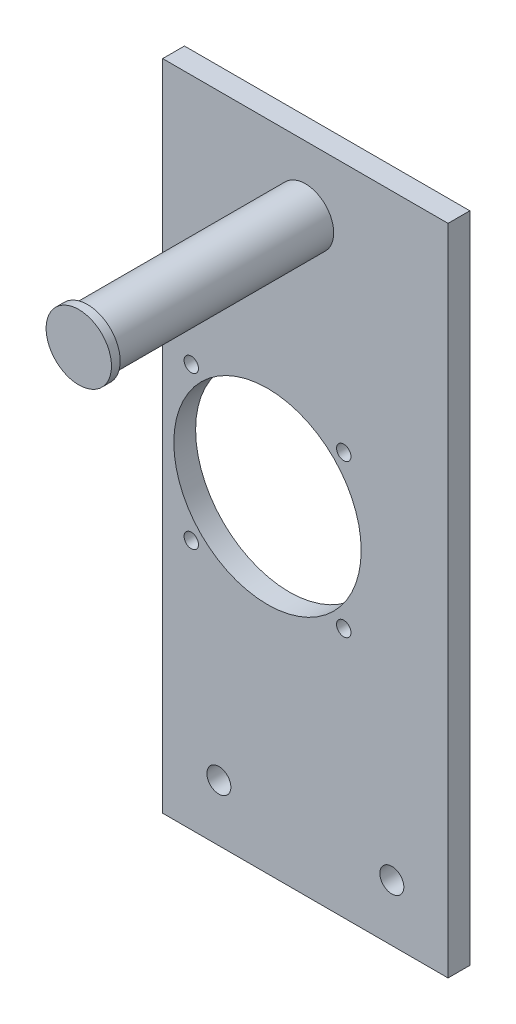
ISO-10303-21;
HEADER;
FILE_DESCRIPTION(('STEP AP214'),'2;1');
FILE_NAME('part.step','',(''),(''),'','','');
FILE_SCHEMA(('AUTOMOTIVE_DESIGN { 1 0 10303 214 1 1 1 1 }'));
ENDSEC;
DATA;
#1=APPLICATION_CONTEXT('core data for automotive mechanical design processes');
#2=APPLICATION_PROTOCOL_DEFINITION('international standard','automotive_design',2000,#1);
#3=PRODUCT_CONTEXT('',#1,'mechanical');
#4=PRODUCT('Part','Part','',(#3));
#5=PRODUCT_RELATED_PRODUCT_CATEGORY('part','',(#4));
#6=PRODUCT_DEFINITION_FORMATION('','',#4);
#7=PRODUCT_DEFINITION_CONTEXT('part definition',#1,'design');
#8=PRODUCT_DEFINITION('design','',#6,#7);
#9=PRODUCT_DEFINITION_SHAPE('','',#8);
#10=(LENGTH_UNIT() NAMED_UNIT(*) SI_UNIT(.MILLI.,.METRE.));
#11=(NAMED_UNIT(*) PLANE_ANGLE_UNIT() SI_UNIT($,.RADIAN.));
#12=(NAMED_UNIT(*) SI_UNIT($,.STERADIAN.) SOLID_ANGLE_UNIT());
#13=UNCERTAINTY_MEASURE_WITH_UNIT(LENGTH_MEASURE(1.E-05),#10,'distance_accuracy_value','');
#14=(GEOMETRIC_REPRESENTATION_CONTEXT(3) GLOBAL_UNCERTAINTY_ASSIGNED_CONTEXT((#13)) GLOBAL_UNIT_ASSIGNED_CONTEXT((#10,
#11,#12)) REPRESENTATION_CONTEXT('',''));
#15=CARTESIAN_POINT('',(0.,0.,0.));
#16=DIRECTION('',(0.,0.,1.));
#17=DIRECTION('',(1.,0.,0.));
#18=AXIS2_PLACEMENT_3D('',#15,#16,#17);
#19=CARTESIAN_POINT('',(0.,0.,5.));
#20=DIRECTION('',(0.,0.,1.));
#21=DIRECTION('',(1.,0.,0.));
#22=AXIS2_PLACEMENT_3D('',#19,#20,#21);
#23=PLANE('',#22);
#24=CARTESIAN_POINT('',(8.81290508670128,-17.5,5.));
#25=DIRECTION('',(0.,0.,1.));
#26=DIRECTION('',(1.,0.,0.));
#27=AXIS2_PLACEMENT_3D('',#24,#25,#26);
#28=CIRCLE('',#27,1.65);
#29=CARTESIAN_POINT('',(7.16290508670128,-17.5,4.99999999999999));
#30=VERTEX_POINT('',#29);
#31=EDGE_CURVE('E143',#30,#30,#28,.T.);
#32=ORIENTED_EDGE('',*,*,#31,.F.);
#33=EDGE_LOOP('',(#32));
#34=FACE_BOUND('',#33,.T.);
#35=CARTESIAN_POINT('',(-26.1870949132987,17.5,5.));
#36=DIRECTION('',(0.,0.,1.));
#37=DIRECTION('',(1.,0.,0.));
#38=AXIS2_PLACEMENT_3D('',#35,#36,#37);
#39=CIRCLE('',#38,1.65);
#40=CARTESIAN_POINT('',(-27.8370949132987,17.5,4.99999999999999));
#41=VERTEX_POINT('',#40);
#42=EDGE_CURVE('E148',#41,#41,#39,.T.);
#43=ORIENTED_EDGE('',*,*,#42,.F.);
#44=EDGE_LOOP('',(#43));
#45=FACE_BOUND('',#44,.T.);
#46=CARTESIAN_POINT('',(-8.68709491329872,0.,5.));
#47=DIRECTION('',(0.,0.,1.));
#48=DIRECTION('',(1.,0.,0.));
#49=AXIS2_PLACEMENT_3D('',#46,#47,#48);
#50=CIRCLE('',#49,21.5);
#51=CARTESIAN_POINT('',(-30.1870949132987,0.,4.99999999999999));
#52=VERTEX_POINT('',#51);
#53=EDGE_CURVE('E151',#52,#52,#50,.T.);
#54=ORIENTED_EDGE('',*,*,#53,.F.);
#55=EDGE_LOOP('',(#54));
#56=FACE_BOUND('',#55,.T.);
#57=CARTESIAN_POINT('',(-26.1870949132987,-17.5,5.));
#58=DIRECTION('',(0.,0.,1.));
#59=DIRECTION('',(1.,0.,0.));
#60=AXIS2_PLACEMENT_3D('',#57,#58,#59);
#61=CIRCLE('',#60,1.65);
#62=CARTESIAN_POINT('',(-27.8370949132987,-17.5,4.99999999999999));
#63=VERTEX_POINT('',#62);
#64=EDGE_CURVE('E154',#63,#63,#61,.T.);
#65=ORIENTED_EDGE('',*,*,#64,.F.);
#66=EDGE_LOOP('',(#65));
#67=FACE_BOUND('',#66,.T.);
#68=CARTESIAN_POINT('',(8.81290508670128,17.5,5.));
#69=DIRECTION('',(0.,0.,1.));
#70=DIRECTION('',(1.,0.,0.));
#71=AXIS2_PLACEMENT_3D('',#68,#69,#70);
#72=CIRCLE('',#71,1.65);
#73=CARTESIAN_POINT('',(7.16290508670128,17.5,4.99999999999999));
#74=VERTEX_POINT('',#73);
#75=EDGE_CURVE('E157',#74,#74,#72,.T.);
#76=ORIENTED_EDGE('',*,*,#75,.F.);
#77=EDGE_LOOP('',(#76));
#78=FACE_BOUND('',#77,.T.);
#79=CARTESIAN_POINT('',(0.,60.,5.));
#80=DIRECTION('',(0.,0.,1.));
#81=DIRECTION('',(1.,0.,0.));
#82=AXIS2_PLACEMENT_3D('',#79,#80,#81);
#83=CIRCLE('',#82,6.5);
#84=CARTESIAN_POINT('',(6.5,60.,5.));
#85=VERTEX_POINT('',#84);
#86=EDGE_CURVE('E134',#85,#85,#83,.T.);
#87=ORIENTED_EDGE('',*,*,#86,.F.);
#88=EDGE_LOOP('',(#87));
#89=FACE_BOUND('',#88,.T.);
#90=CARTESIAN_POINT('',(-19.85,-62.,5.));
#91=DIRECTION('',(0.,0.,1.));
#92=DIRECTION('',(1.,0.,0.));
#93=AXIS2_PLACEMENT_3D('',#90,#91,#92);
#94=CIRCLE('',#93,2.75);
#95=CARTESIAN_POINT('',(-17.1,-62.,5.));
#96=VERTEX_POINT('',#95);
#97=EDGE_CURVE('E110',#96,#96,#94,.T.);
#98=ORIENTED_EDGE('',*,*,#97,.F.);
#99=EDGE_LOOP('',(#98));
#100=FACE_BOUND('',#99,.T.);
#101=DIRECTION('',(0.,-1.,0.));
#102=VECTOR('',#101,1.);
#103=CARTESIAN_POINT('',(-32.75,-75.,5.));
#104=LINE('',#103,#102);
#105=CARTESIAN_POINT('',(-32.75,75.,5.));
#106=VERTEX_POINT('',#105);
#107=CARTESIAN_POINT('',(-32.75,-75.,5.));
#108=VERTEX_POINT('',#107);
#109=EDGE_CURVE('E95',#106,#108,#104,.T.);
#110=ORIENTED_EDGE('',*,*,#109,.T.);
#111=DIRECTION('',(1.,0.,0.));
#112=VECTOR('',#111,1.);
#113=CARTESIAN_POINT('',(32.75,-75.,5.));
#114=LINE('',#113,#112);
#115=CARTESIAN_POINT('',(32.75,-75.,5.));
#116=VERTEX_POINT('',#115);
#117=EDGE_CURVE('E90',#108,#116,#114,.T.);
#118=ORIENTED_EDGE('',*,*,#117,.T.);
#119=DIRECTION('',(0.,1.,0.));
#120=VECTOR('',#119,1.);
#121=CARTESIAN_POINT('',(32.75,-75.,5.));
#122=LINE('',#121,#120);
#123=CARTESIAN_POINT('',(32.75,75.,5.));
#124=VERTEX_POINT('',#123);
#125=EDGE_CURVE('E93',#116,#124,#122,.T.);
#126=ORIENTED_EDGE('',*,*,#125,.T.);
#127=DIRECTION('',(-1.,0.,0.));
#128=VECTOR('',#127,1.);
#129=CARTESIAN_POINT('',(32.75,75.,5.));
#130=LINE('',#129,#128);
#131=EDGE_CURVE('E60',#124,#106,#130,.T.);
#132=ORIENTED_EDGE('',*,*,#131,.T.);
#133=EDGE_LOOP('',(#110,#118,#126,#132));
#134=FACE_BOUND('',#133,.T.);
#135=CARTESIAN_POINT('',(19.85,-62.,5.));
#136=DIRECTION('',(0.,0.,1.));
#137=DIRECTION('',(1.,0.,0.));
#138=AXIS2_PLACEMENT_3D('',#135,#136,#137);
#139=CIRCLE('',#138,2.75);
#140=CARTESIAN_POINT('',(22.6,-62.,5.));
#141=VERTEX_POINT('',#140);
#142=EDGE_CURVE('E125',#141,#141,#139,.T.);
#143=ORIENTED_EDGE('',*,*,#142,.F.);
#144=EDGE_LOOP('',(#143));
#145=FACE_BOUND('',#144,.T.);
#146=ADVANCED_FACE('F43',(#34,#45,#56,#67,#78,#89,#100,#134,#145),#23,.T.);
#147=CARTESIAN_POINT('',(0.,0.,0.));
#148=DIRECTION('',(0.,0.,1.));
#149=DIRECTION('',(1.,0.,0.));
#150=AXIS2_PLACEMENT_3D('',#147,#148,#149);
#151=PLANE('',#150);
#152=CARTESIAN_POINT('',(8.81290508670128,-17.5,0.));
#153=DIRECTION('',(0.,0.,-1.));
#154=DIRECTION('',(-1.,0.,0.));
#155=AXIS2_PLACEMENT_3D('',#152,#153,#154);
#156=CIRCLE('',#155,1.65);
#157=CARTESIAN_POINT('',(7.16290508670128,-17.5,0.));
#158=VERTEX_POINT('',#157);
#159=EDGE_CURVE('E163',#158,#158,#156,.T.);
#160=ORIENTED_EDGE('',*,*,#159,.F.);
#161=EDGE_LOOP('',(#160));
#162=FACE_BOUND('',#161,.T.);
#163=CARTESIAN_POINT('',(-26.1870949132987,17.5,0.));
#164=DIRECTION('',(0.,0.,-1.));
#165=DIRECTION('',(-1.,0.,0.));
#166=AXIS2_PLACEMENT_3D('',#163,#164,#165);
#167=CIRCLE('',#166,1.65);
#168=CARTESIAN_POINT('',(-27.8370949132987,17.5,0.));
#169=VERTEX_POINT('',#168);
#170=EDGE_CURVE('E164',#169,#169,#167,.T.);
#171=ORIENTED_EDGE('',*,*,#170,.F.);
#172=EDGE_LOOP('',(#171));
#173=FACE_BOUND('',#172,.T.);
#174=CARTESIAN_POINT('',(-8.68709491329872,0.,0.));
#175=DIRECTION('',(0.,0.,-1.));
#176=DIRECTION('',(-1.,0.,0.));
#177=AXIS2_PLACEMENT_3D('',#174,#175,#176);
#178=CIRCLE('',#177,21.5);
#179=CARTESIAN_POINT('',(-30.1870949132987,0.,0.));
#180=VERTEX_POINT('',#179);
#181=EDGE_CURVE('E172',#180,#180,#178,.T.);
#182=ORIENTED_EDGE('',*,*,#181,.F.);
#183=EDGE_LOOP('',(#182));
#184=FACE_BOUND('',#183,.T.);
#185=CARTESIAN_POINT('',(-26.1870949132987,-17.5,0.));
#186=DIRECTION('',(0.,0.,-1.));
#187=DIRECTION('',(-1.,0.,0.));
#188=AXIS2_PLACEMENT_3D('',#185,#186,#187);
#189=CIRCLE('',#188,1.65);
#190=CARTESIAN_POINT('',(-27.8370949132987,-17.5,0.));
#191=VERTEX_POINT('',#190);
#192=EDGE_CURVE('E167',#191,#191,#189,.T.);
#193=ORIENTED_EDGE('',*,*,#192,.F.);
#194=EDGE_LOOP('',(#193));
#195=FACE_BOUND('',#194,.T.);
#196=CARTESIAN_POINT('',(8.81290508670128,17.5,0.));
#197=DIRECTION('',(0.,0.,-1.));
#198=DIRECTION('',(-1.,0.,0.));
#199=AXIS2_PLACEMENT_3D('',#196,#197,#198);
#200=CIRCLE('',#199,1.65);
#201=CARTESIAN_POINT('',(7.16290508670128,17.5,0.));
#202=VERTEX_POINT('',#201);
#203=EDGE_CURVE('E160',#202,#202,#200,.T.);
#204=ORIENTED_EDGE('',*,*,#203,.F.);
#205=EDGE_LOOP('',(#204));
#206=FACE_BOUND('',#205,.T.);
#207=DIRECTION('',(0.,-1.,0.));
#208=VECTOR('',#207,1.);
#209=CARTESIAN_POINT('',(-32.75,-75.,0.));
#210=LINE('',#209,#208);
#211=CARTESIAN_POINT('',(-32.75,75.,0.));
#212=VERTEX_POINT('',#211);
#213=CARTESIAN_POINT('',(-32.75,-75.,0.));
#214=VERTEX_POINT('',#213);
#215=EDGE_CURVE('E107',#212,#214,#210,.T.);
#216=ORIENTED_EDGE('',*,*,#215,.F.);
#217=DIRECTION('',(-1.,0.,0.));
#218=VECTOR('',#217,1.);
#219=CARTESIAN_POINT('',(32.75,75.,0.));
#220=LINE('',#219,#218);
#221=CARTESIAN_POINT('',(32.75,75.,0.));
#222=VERTEX_POINT('',#221);
#223=EDGE_CURVE('E83',#222,#212,#220,.T.);
#224=ORIENTED_EDGE('',*,*,#223,.F.);
#225=DIRECTION('',(0.,1.,0.));
#226=VECTOR('',#225,1.);
#227=CARTESIAN_POINT('',(32.75,-75.,0.));
#228=LINE('',#227,#226);
#229=CARTESIAN_POINT('',(32.75,-75.,0.));
#230=VERTEX_POINT('',#229);
#231=EDGE_CURVE('E77',#230,#222,#228,.T.);
#232=ORIENTED_EDGE('',*,*,#231,.F.);
#233=DIRECTION('',(1.,0.,0.));
#234=VECTOR('',#233,1.);
#235=CARTESIAN_POINT('',(32.75,-75.,0.));
#236=LINE('',#235,#234);
#237=EDGE_CURVE('E99',#214,#230,#236,.T.);
#238=ORIENTED_EDGE('',*,*,#237,.F.);
#239=EDGE_LOOP('',(#216,#224,#232,#238));
#240=FACE_BOUND('',#239,.T.);
#241=CARTESIAN_POINT('',(-19.85,-62.,0.));
#242=DIRECTION('',(0.,0.,1.));
#243=DIRECTION('',(1.,0.,0.));
#244=AXIS2_PLACEMENT_3D('',#241,#242,#243);
#245=CIRCLE('',#244,2.75);
#246=CARTESIAN_POINT('',(-17.1,-62.,0.));
#247=VERTEX_POINT('',#246);
#248=EDGE_CURVE('E122',#247,#247,#245,.T.);
#249=ORIENTED_EDGE('',*,*,#248,.T.);
#250=EDGE_LOOP('',(#249));
#251=FACE_BOUND('',#250,.T.);
#252=CARTESIAN_POINT('',(19.85,-62.,0.));
#253=DIRECTION('',(0.,0.,1.));
#254=DIRECTION('',(1.,0.,0.));
#255=AXIS2_PLACEMENT_3D('',#252,#253,#254);
#256=CIRCLE('',#255,2.75);
#257=CARTESIAN_POINT('',(22.6,-62.,0.));
#258=VERTEX_POINT('',#257);
#259=EDGE_CURVE('E128',#258,#258,#256,.T.);
#260=ORIENTED_EDGE('',*,*,#259,.T.);
#261=EDGE_LOOP('',(#260));
#262=FACE_BOUND('',#261,.T.);
#263=ADVANCED_FACE('F118',(#162,#173,#184,#195,#206,#240,#251,#262),#151,.F.);
#264=CARTESIAN_POINT('',(-32.75,-75.,5.));
#265=DIRECTION('',(1.,0.,0.));
#266=DIRECTION('',(0.,0.,-1.));
#267=AXIS2_PLACEMENT_3D('',#264,#265,#266);
#268=PLANE('',#267);
#269=ORIENTED_EDGE('',*,*,#215,.T.);
#270=DIRECTION('',(0.,0.,-1.));
#271=VECTOR('',#270,1.);
#272=CARTESIAN_POINT('',(-32.75,-75.,5.));
#273=LINE('',#272,#271);
#274=EDGE_CURVE('E11',#108,#214,#273,.T.);
#275=ORIENTED_EDGE('',*,*,#274,.F.);
#276=ORIENTED_EDGE('',*,*,#109,.F.);
#277=DIRECTION('',(0.,0.,-1.));
#278=VECTOR('',#277,1.);
#279=CARTESIAN_POINT('',(-32.75,75.,5.));
#280=LINE('',#279,#278);
#281=EDGE_CURVE('E103',#106,#212,#280,.T.);
#282=ORIENTED_EDGE('',*,*,#281,.T.);
#283=EDGE_LOOP('',(#269,#275,#276,#282));
#284=FACE_BOUND('',#283,.T.);
#285=ADVANCED_FACE('F45',(#284),#268,.F.);
#286=CARTESIAN_POINT('',(32.75,-75.,5.));
#287=DIRECTION('',(0.,1.,0.));
#288=DIRECTION('',(0.,0.,1.));
#289=AXIS2_PLACEMENT_3D('',#286,#287,#288);
#290=PLANE('',#289);
#291=ORIENTED_EDGE('',*,*,#237,.T.);
#292=DIRECTION('',(0.,0.,-1.));
#293=VECTOR('',#292,1.);
#294=CARTESIAN_POINT('',(32.75,-75.,5.));
#295=LINE('',#294,#293);
#296=EDGE_CURVE('E52',#116,#230,#295,.T.);
#297=ORIENTED_EDGE('',*,*,#296,.F.);
#298=ORIENTED_EDGE('',*,*,#117,.F.);
#299=ORIENTED_EDGE('',*,*,#274,.T.);
#300=EDGE_LOOP('',(#291,#297,#298,#299));
#301=FACE_BOUND('',#300,.T.);
#302=ADVANCED_FACE('F98',(#301),#290,.F.);
#303=CARTESIAN_POINT('',(32.75,-75.,5.));
#304=DIRECTION('',(-1.,0.,0.));
#305=DIRECTION('',(0.,0.,1.));
#306=AXIS2_PLACEMENT_3D('',#303,#304,#305);
#307=PLANE('',#306);
#308=ORIENTED_EDGE('',*,*,#231,.T.);
#309=DIRECTION('',(0.,0.,-1.));
#310=VECTOR('',#309,1.);
#311=CARTESIAN_POINT('',(32.75,75.,5.));
#312=LINE('',#311,#310);
#313=EDGE_CURVE('E100',#124,#222,#312,.T.);
#314=ORIENTED_EDGE('',*,*,#313,.F.);
#315=ORIENTED_EDGE('',*,*,#125,.F.);
#316=ORIENTED_EDGE('',*,*,#296,.T.);
#317=EDGE_LOOP('',(#308,#314,#315,#316));
#318=FACE_BOUND('',#317,.T.);
#319=ADVANCED_FACE('F101',(#318),#307,.F.);
#320=CARTESIAN_POINT('',(32.75,75.,5.));
#321=DIRECTION('',(0.,-1.,0.));
#322=DIRECTION('',(1.,0.,0.));
#323=AXIS2_PLACEMENT_3D('',#320,#321,#322);
#324=PLANE('',#323);
#325=ORIENTED_EDGE('',*,*,#223,.T.);
#326=ORIENTED_EDGE('',*,*,#281,.F.);
#327=ORIENTED_EDGE('',*,*,#131,.F.);
#328=ORIENTED_EDGE('',*,*,#313,.T.);
#329=EDGE_LOOP('',(#325,#326,#327,#328));
#330=FACE_BOUND('',#329,.T.);
#331=ADVANCED_FACE('F115',(#330),#324,.F.);
#332=CARTESIAN_POINT('',(-19.85,-62.,5.));
#333=DIRECTION('',(0.,0.,-1.));
#334=DIRECTION('',(-1.,0.,0.));
#335=AXIS2_PLACEMENT_3D('',#332,#333,#334);
#336=CYLINDRICAL_SURFACE('',#335,2.75);
#337=ORIENTED_EDGE('',*,*,#97,.T.);
#338=EDGE_LOOP('',(#337));
#339=FACE_BOUND('',#338,.T.);
#340=ORIENTED_EDGE('',*,*,#248,.F.);
#341=EDGE_LOOP('',(#340));
#342=FACE_BOUND('',#341,.T.);
#343=ADVANCED_FACE('F211',(#339,#342),#336,.F.);
#344=CARTESIAN_POINT('',(19.85,-62.,5.));
#345=DIRECTION('',(0.,0.,-1.));
#346=DIRECTION('',(-1.,0.,0.));
#347=AXIS2_PLACEMENT_3D('',#344,#345,#346);
#348=CYLINDRICAL_SURFACE('',#347,2.75);
#349=ORIENTED_EDGE('',*,*,#142,.T.);
#350=EDGE_LOOP('',(#349));
#351=FACE_BOUND('',#350,.T.);
#352=ORIENTED_EDGE('',*,*,#259,.F.);
#353=EDGE_LOOP('',(#352));
#354=FACE_BOUND('',#353,.T.);
#355=ADVANCED_FACE('F253',(#351,#354),#348,.F.);
#356=CARTESIAN_POINT('',(0.,60.,55.));
#357=DIRECTION('',(0.,0.,-1.));
#358=DIRECTION('',(-1.,0.,0.));
#359=AXIS2_PLACEMENT_3D('',#356,#357,#358);
#360=CYLINDRICAL_SURFACE('',#359,6.5);
#361=CARTESIAN_POINT('',(0.,60.,55.));
#362=DIRECTION('',(0.,0.,1.));
#363=DIRECTION('',(1.,0.,0.));
#364=AXIS2_PLACEMENT_3D('',#361,#362,#363);
#365=CIRCLE('',#364,6.5);
#366=CARTESIAN_POINT('',(6.5,60.,55.));
#367=VERTEX_POINT('',#366);
#368=EDGE_CURVE('E131',#367,#367,#365,.T.);
#369=ORIENTED_EDGE('',*,*,#368,.F.);
#370=EDGE_LOOP('',(#369));
#371=FACE_BOUND('',#370,.T.);
#372=ORIENTED_EDGE('',*,*,#86,.T.);
#373=EDGE_LOOP('',(#372));
#374=FACE_BOUND('',#373,.T.);
#375=ADVANCED_FACE('F262',(#371,#374),#360,.T.);
#376=CARTESIAN_POINT('',(0.,60.,57.));
#377=DIRECTION('',(0.,0.,-1.));
#378=DIRECTION('',(-1.,0.,0.));
#379=AXIS2_PLACEMENT_3D('',#376,#377,#378);
#380=CYLINDRICAL_SURFACE('',#379,7.5);
#381=CARTESIAN_POINT('',(0.,60.,57.));
#382=DIRECTION('',(0.,0.,1.));
#383=DIRECTION('',(1.,0.,0.));
#384=AXIS2_PLACEMENT_3D('',#381,#382,#383);
#385=CIRCLE('',#384,7.5);
#386=CARTESIAN_POINT('',(7.5,60.,57.));
#387=VERTEX_POINT('',#386);
#388=EDGE_CURVE('E137',#387,#387,#385,.T.);
#389=ORIENTED_EDGE('',*,*,#388,.F.);
#390=EDGE_LOOP('',(#389));
#391=FACE_BOUND('',#390,.T.);
#392=CARTESIAN_POINT('',(0.,60.,55.));
#393=DIRECTION('',(0.,0.,1.));
#394=DIRECTION('',(1.,0.,0.));
#395=AXIS2_PLACEMENT_3D('',#392,#393,#394);
#396=CIRCLE('',#395,7.5);
#397=CARTESIAN_POINT('',(7.5,60.,55.));
#398=VERTEX_POINT('',#397);
#399=EDGE_CURVE('E140',#398,#398,#396,.T.);
#400=ORIENTED_EDGE('',*,*,#399,.T.);
#401=EDGE_LOOP('',(#400));
#402=FACE_BOUND('',#401,.T.);
#403=ADVANCED_FACE('F271',(#391,#402),#380,.T.);
#404=CARTESIAN_POINT('',(0.,60.,57.));
#405=DIRECTION('',(0.,0.,1.));
#406=DIRECTION('',(1.,0.,0.));
#407=AXIS2_PLACEMENT_3D('',#404,#405,#406);
#408=PLANE('',#407);
#409=ORIENTED_EDGE('',*,*,#388,.T.);
#410=EDGE_LOOP('',(#409));
#411=FACE_BOUND('',#410,.T.);
#412=ADVANCED_FACE('F198',(#411),#408,.T.);
#413=CARTESIAN_POINT('',(0.,60.,55.));
#414=DIRECTION('',(0.,0.,1.));
#415=DIRECTION('',(1.,0.,0.));
#416=AXIS2_PLACEMENT_3D('',#413,#414,#415);
#417=PLANE('',#416);
#418=ORIENTED_EDGE('',*,*,#368,.T.);
#419=EDGE_LOOP('',(#418));
#420=FACE_BOUND('',#419,.T.);
#421=ORIENTED_EDGE('',*,*,#399,.F.);
#422=EDGE_LOOP('',(#421));
#423=FACE_BOUND('',#422,.T.);
#424=ADVANCED_FACE('F189',(#420,#423),#417,.F.);
#425=CARTESIAN_POINT('',(8.81290508670128,17.5,57.));
#426=DIRECTION('',(0.,0.,-1.));
#427=DIRECTION('',(-1.,0.,0.));
#428=AXIS2_PLACEMENT_3D('',#425,#426,#427);
#429=CYLINDRICAL_SURFACE('',#428,1.65);
#430=CARTESIAN_POINT('',(7.16290508670128,17.5,4.99999999999999));
#431=CARTESIAN_POINT('',(7.16290508670128,17.5,4.94791666666666));
#432=CARTESIAN_POINT('',(7.16290508670128,17.5,4.89583333333333));
#433=CARTESIAN_POINT('',(7.16290508670128,17.5,4.79166666666666));
#434=CARTESIAN_POINT('',(7.16290508670128,17.5,4.73958333333333));
#435=CARTESIAN_POINT('',(7.16290508670128,17.5,4.63541666666666));
#436=CARTESIAN_POINT('',(7.16290508670128,17.5,4.58333333333333));
#437=CARTESIAN_POINT('',(7.16290508670128,17.5,4.47916666666666));
#438=CARTESIAN_POINT('',(7.16290508670128,17.5,4.42708333333332));
#439=CARTESIAN_POINT('',(7.16290508670128,17.5,4.32291666666666));
#440=CARTESIAN_POINT('',(7.16290508670128,17.5,4.27083333333333));
#441=CARTESIAN_POINT('',(7.16290508670128,17.5,4.16666666666666));
#442=CARTESIAN_POINT('',(7.16290508670128,17.5,4.11458333333332));
#443=CARTESIAN_POINT('',(7.16290508670128,17.5,4.01041666666666));
#444=CARTESIAN_POINT('',(7.16290508670128,17.5,3.95833333333333));
#445=CARTESIAN_POINT('',(7.16290508670128,17.5,3.85416666666666));
#446=CARTESIAN_POINT('',(7.16290508670128,17.5,3.80208333333332));
#447=CARTESIAN_POINT('',(7.16290508670128,17.5,3.69791666666666));
#448=CARTESIAN_POINT('',(7.16290508670128,17.5,3.64583333333333));
#449=CARTESIAN_POINT('',(7.16290508670128,17.5,3.54166666666666));
#450=CARTESIAN_POINT('',(7.16290508670128,17.5,3.48958333333333));
#451=CARTESIAN_POINT('',(7.16290508670128,17.5,3.38541666666666));
#452=CARTESIAN_POINT('',(7.16290508670128,17.5,3.33333333333333));
#453=CARTESIAN_POINT('',(7.16290508670128,17.5,3.22916666666666));
#454=CARTESIAN_POINT('',(7.16290508670128,17.5,3.17708333333333));
#455=CARTESIAN_POINT('',(7.16290508670128,17.5,3.07291666666666));
#456=CARTESIAN_POINT('',(7.16290508670128,17.5,3.02083333333333));
#457=CARTESIAN_POINT('',(7.16290508670128,17.5,2.91666666666666));
#458=CARTESIAN_POINT('',(7.16290508670128,17.5,2.86458333333333));
#459=CARTESIAN_POINT('',(7.16290508670128,17.5,2.76041666666666));
#460=CARTESIAN_POINT('',(7.16290508670128,17.5,2.70833333333333));
#461=CARTESIAN_POINT('',(7.16290508670128,17.5,2.60416666666666));
#462=CARTESIAN_POINT('',(7.16290508670128,17.5,2.55208333333333));
#463=CARTESIAN_POINT('',(7.16290508670128,17.5,2.44791666666666));
#464=CARTESIAN_POINT('',(7.16290508670128,17.5,2.39583333333333));
#465=CARTESIAN_POINT('',(7.16290508670128,17.5,2.29166666666666));
#466=CARTESIAN_POINT('',(7.16290508670128,17.5,2.23958333333333));
#467=CARTESIAN_POINT('',(7.16290508670128,17.5,2.13541666666666));
#468=CARTESIAN_POINT('',(7.16290508670128,17.5,2.08333333333333));
#469=CARTESIAN_POINT('',(7.16290508670128,17.5,1.97916666666666));
#470=CARTESIAN_POINT('',(7.16290508670128,17.5,1.92708333333333));
#471=CARTESIAN_POINT('',(7.16290508670128,17.5,1.82291666666666));
#472=CARTESIAN_POINT('',(7.16290508670128,17.5,1.77083333333333));
#473=CARTESIAN_POINT('',(7.16290508670128,17.5,1.66666666666666));
#474=CARTESIAN_POINT('',(7.16290508670128,17.5,1.61458333333333));
#475=CARTESIAN_POINT('',(7.16290508670128,17.5,1.51041666666666));
#476=CARTESIAN_POINT('',(7.16290508670128,17.5,1.45833333333333));
#477=CARTESIAN_POINT('',(7.16290508670128,17.5,1.35416666666667));
#478=CARTESIAN_POINT('',(7.16290508670128,17.5,1.30208333333333));
#479=CARTESIAN_POINT('',(7.16290508670128,17.5,1.19791666666667));
#480=CARTESIAN_POINT('',(7.16290508670128,17.5,1.14583333333333));
#481=CARTESIAN_POINT('',(7.16290508670128,17.5,1.04166666666667));
#482=CARTESIAN_POINT('',(7.16290508670128,17.5,0.989583333333333));
#483=CARTESIAN_POINT('',(7.16290508670128,17.5,0.885416666666666));
#484=CARTESIAN_POINT('',(7.16290508670128,17.5,0.833333333333332));
#485=CARTESIAN_POINT('',(7.16290508670128,17.5,0.729166666666665));
#486=CARTESIAN_POINT('',(7.16290508670128,17.5,0.677083333333333));
#487=CARTESIAN_POINT('',(7.16290508670128,17.5,0.572916666666666));
#488=CARTESIAN_POINT('',(7.16290508670128,17.5,0.520833333333331));
#489=CARTESIAN_POINT('',(7.16290508670128,17.5,0.416666666666665));
#490=CARTESIAN_POINT('',(7.16290508670128,17.5,0.364583333333332));
#491=CARTESIAN_POINT('',(7.16290508670128,17.5,0.260416666666666));
#492=CARTESIAN_POINT('',(7.16290508670128,17.5,0.208333333333331));
#493=CARTESIAN_POINT('',(7.16290508670128,17.5,0.104166666666664));
#494=CARTESIAN_POINT('',(7.16290508670128,17.5,0.0520833333333322));
#495=CARTESIAN_POINT('',(7.16290508670128,17.5,0.));
#496=B_SPLINE_CURVE_WITH_KNOTS('',3,(#430,#431,#432,#433,#434,#435,#436,#437,#438,#439,#440,
#441,#442,#443,#444,#445,#446,#447,#448,#449,#450,#451,#452,#453,#454,#455,#456,#457,#458,#459,
#460,#461,#462,#463,#464,#465,#466,#467,#468,#469,#470,#471,#472,#473,#474,#475,#476,#477,#478,
#479,#480,#481,#482,#483,#484,#485,#486,#487,#488,#489,#490,#491,#492,#493,#494,#495),
.UNSPECIFIED.,.F.,.F.,(4,2,2,2,2,2,2,2,2,2,2,2,2,2,2,2,2,2,2,2,2,2,2,2,2,2,2,2,2,2,2,2,4),(0.,
0.156249999999997,0.3125,0.468749999999997,0.625000000000001,0.781249999999997,
0.937500000000001,1.09375,1.25,1.40625,1.56249999999999,1.71875,1.87499999999999,2.03125,2.1875,
2.34375,2.5,2.65624999999999,2.8125,2.96874999999999,3.125,3.28124999999999,3.4375,
3.59374999999999,3.74999999999999,3.90624999999999,4.06249999999999,4.21874999999999,
4.37499999999999,4.53124999999999,4.68749999999999,4.84374999999999,4.99999999999999),.UNSPECIFIED.);
#497=EDGE_CURVE('BSEAM186',#74,#202,#496,.T.);
#498=ORIENTED_EDGE('',*,*,#75,.T.);
#499=ORIENTED_EDGE('',*,*,#203,.T.);
#500=ORIENTED_EDGE('',*,*,#497,.T.);
#501=ORIENTED_EDGE('',*,*,#497,.F.);
#502=EDGE_LOOP('',(#498,#500,#499,#501));
#503=FACE_BOUND('',#502,.T.);
#504=ADVANCED_FACE('F186',(#503),#429,.F.);
#505=CARTESIAN_POINT('',(-26.1870949132987,-17.5,57.));
#506=DIRECTION('',(0.,0.,-1.));
#507=DIRECTION('',(-1.,0.,0.));
#508=AXIS2_PLACEMENT_3D('',#505,#506,#507);
#509=CYLINDRICAL_SURFACE('',#508,1.65);
#510=CARTESIAN_POINT('',(-27.8370949132987,-17.5,4.99999999999999));
#511=CARTESIAN_POINT('',(-27.8370949132987,-17.5,4.94791666666666));
#512=CARTESIAN_POINT('',(-27.8370949132987,-17.5,4.89583333333333));
#513=CARTESIAN_POINT('',(-27.8370949132987,-17.5,4.79166666666666));
#514=CARTESIAN_POINT('',(-27.8370949132987,-17.5,4.73958333333333));
#515=CARTESIAN_POINT('',(-27.8370949132987,-17.5,4.63541666666666));
#516=CARTESIAN_POINT('',(-27.8370949132987,-17.5,4.58333333333333));
#517=CARTESIAN_POINT('',(-27.8370949132987,-17.5,4.47916666666666));
#518=CARTESIAN_POINT('',(-27.8370949132987,-17.5,4.42708333333332));
#519=CARTESIAN_POINT('',(-27.8370949132987,-17.5,4.32291666666666));
#520=CARTESIAN_POINT('',(-27.8370949132987,-17.5,4.27083333333333));
#521=CARTESIAN_POINT('',(-27.8370949132987,-17.5,4.16666666666666));
#522=CARTESIAN_POINT('',(-27.8370949132987,-17.5,4.11458333333332));
#523=CARTESIAN_POINT('',(-27.8370949132987,-17.5,4.01041666666666));
#524=CARTESIAN_POINT('',(-27.8370949132987,-17.5,3.95833333333333));
#525=CARTESIAN_POINT('',(-27.8370949132987,-17.5,3.85416666666666));
#526=CARTESIAN_POINT('',(-27.8370949132987,-17.5,3.80208333333332));
#527=CARTESIAN_POINT('',(-27.8370949132987,-17.5,3.69791666666666));
#528=CARTESIAN_POINT('',(-27.8370949132987,-17.5,3.64583333333333));
#529=CARTESIAN_POINT('',(-27.8370949132987,-17.5,3.54166666666666));
#530=CARTESIAN_POINT('',(-27.8370949132987,-17.5,3.48958333333333));
#531=CARTESIAN_POINT('',(-27.8370949132987,-17.5,3.38541666666666));
#532=CARTESIAN_POINT('',(-27.8370949132987,-17.5,3.33333333333333));
#533=CARTESIAN_POINT('',(-27.8370949132987,-17.5,3.22916666666666));
#534=CARTESIAN_POINT('',(-27.8370949132987,-17.5,3.17708333333333));
#535=CARTESIAN_POINT('',(-27.8370949132987,-17.5,3.07291666666666));
#536=CARTESIAN_POINT('',(-27.8370949132987,-17.5,3.02083333333333));
#537=CARTESIAN_POINT('',(-27.8370949132987,-17.5,2.91666666666666));
#538=CARTESIAN_POINT('',(-27.8370949132987,-17.5,2.86458333333333));
#539=CARTESIAN_POINT('',(-27.8370949132987,-17.5,2.76041666666666));
#540=CARTESIAN_POINT('',(-27.8370949132987,-17.5,2.70833333333333));
#541=CARTESIAN_POINT('',(-27.8370949132987,-17.5,2.60416666666666));
#542=CARTESIAN_POINT('',(-27.8370949132987,-17.5,2.55208333333333));
#543=CARTESIAN_POINT('',(-27.8370949132987,-17.5,2.44791666666666));
#544=CARTESIAN_POINT('',(-27.8370949132987,-17.5,2.39583333333333));
#545=CARTESIAN_POINT('',(-27.8370949132987,-17.5,2.29166666666666));
#546=CARTESIAN_POINT('',(-27.8370949132987,-17.5,2.23958333333333));
#547=CARTESIAN_POINT('',(-27.8370949132987,-17.5,2.13541666666666));
#548=CARTESIAN_POINT('',(-27.8370949132987,-17.5,2.08333333333333));
#549=CARTESIAN_POINT('',(-27.8370949132987,-17.5,1.97916666666666));
#550=CARTESIAN_POINT('',(-27.8370949132987,-17.5,1.92708333333333));
#551=CARTESIAN_POINT('',(-27.8370949132987,-17.5,1.82291666666666));
#552=CARTESIAN_POINT('',(-27.8370949132987,-17.5,1.77083333333333));
#553=CARTESIAN_POINT('',(-27.8370949132987,-17.5,1.66666666666666));
#554=CARTESIAN_POINT('',(-27.8370949132987,-17.5,1.61458333333333));
#555=CARTESIAN_POINT('',(-27.8370949132987,-17.5,1.51041666666666));
#556=CARTESIAN_POINT('',(-27.8370949132987,-17.5,1.45833333333333));
#557=CARTESIAN_POINT('',(-27.8370949132987,-17.5,1.35416666666667));
#558=CARTESIAN_POINT('',(-27.8370949132987,-17.5,1.30208333333333));
#559=CARTESIAN_POINT('',(-27.8370949132987,-17.5,1.19791666666667));
#560=CARTESIAN_POINT('',(-27.8370949132987,-17.5,1.14583333333333));
#561=CARTESIAN_POINT('',(-27.8370949132987,-17.5,1.04166666666667));
#562=CARTESIAN_POINT('',(-27.8370949132987,-17.5,0.989583333333333));
#563=CARTESIAN_POINT('',(-27.8370949132987,-17.5,0.885416666666666));
#564=CARTESIAN_POINT('',(-27.8370949132987,-17.5,0.833333333333332));
#565=CARTESIAN_POINT('',(-27.8370949132987,-17.5,0.729166666666665));
#566=CARTESIAN_POINT('',(-27.8370949132987,-17.5,0.677083333333333));
#567=CARTESIAN_POINT('',(-27.8370949132987,-17.5,0.572916666666666));
#568=CARTESIAN_POINT('',(-27.8370949132987,-17.5,0.520833333333331));
#569=CARTESIAN_POINT('',(-27.8370949132987,-17.5,0.416666666666665));
#570=CARTESIAN_POINT('',(-27.8370949132987,-17.5,0.364583333333332));
#571=CARTESIAN_POINT('',(-27.8370949132987,-17.5,0.260416666666666));
#572=CARTESIAN_POINT('',(-27.8370949132987,-17.5,0.208333333333331));
#573=CARTESIAN_POINT('',(-27.8370949132987,-17.5,0.104166666666664));
#574=CARTESIAN_POINT('',(-27.8370949132987,-17.5,0.0520833333333322));
#575=CARTESIAN_POINT('',(-27.8370949132987,-17.5,0.));
#576=B_SPLINE_CURVE_WITH_KNOTS('',3,(#510,#511,#512,#513,#514,#515,#516,#517,#518,#519,#520,
#521,#522,#523,#524,#525,#526,#527,#528,#529,#530,#531,#532,#533,#534,#535,#536,#537,#538,#539,
#540,#541,#542,#543,#544,#545,#546,#547,#548,#549,#550,#551,#552,#553,#554,#555,#556,#557,#558,
#559,#560,#561,#562,#563,#564,#565,#566,#567,#568,#569,#570,#571,#572,#573,#574,#575),
.UNSPECIFIED.,.F.,.F.,(4,2,2,2,2,2,2,2,2,2,2,2,2,2,2,2,2,2,2,2,2,2,2,2,2,2,2,2,2,2,2,2,4),(0.,
0.156249999999997,0.3125,0.468749999999997,0.625000000000001,0.781249999999997,
0.937500000000001,1.09375,1.25,1.40625,1.56249999999999,1.71875,1.87499999999999,2.03125,2.1875,
2.34375,2.5,2.65624999999999,2.8125,2.96874999999999,3.125,3.28124999999999,3.4375,
3.59374999999999,3.74999999999999,3.90624999999999,4.06249999999999,4.21874999999999,
4.37499999999999,4.53124999999999,4.68749999999999,4.84374999999999,4.99999999999999),.UNSPECIFIED.);
#577=EDGE_CURVE('BSEAM188',#63,#191,#576,.T.);
#578=ORIENTED_EDGE('',*,*,#64,.T.);
#579=ORIENTED_EDGE('',*,*,#192,.T.);
#580=ORIENTED_EDGE('',*,*,#577,.T.);
#581=ORIENTED_EDGE('',*,*,#577,.F.);
#582=EDGE_LOOP('',(#578,#580,#579,#581));
#583=FACE_BOUND('',#582,.T.);
#584=ADVANCED_FACE('F188',(#583),#509,.F.);
#585=CARTESIAN_POINT('',(-8.68709491329872,0.,57.));
#586=DIRECTION('',(0.,0.,-1.));
#587=DIRECTION('',(-1.,0.,0.));
#588=AXIS2_PLACEMENT_3D('',#585,#586,#587);
#589=CYLINDRICAL_SURFACE('',#588,21.5);
#590=CARTESIAN_POINT('',(-30.1870949132987,0.,4.99999999999999));
#591=CARTESIAN_POINT('',(-30.1870949132987,0.,4.94791666666666));
#592=CARTESIAN_POINT('',(-30.1870949132987,0.,4.89583333333333));
#593=CARTESIAN_POINT('',(-30.1870949132987,0.,4.79166666666666));
#594=CARTESIAN_POINT('',(-30.1870949132987,0.,4.73958333333333));
#595=CARTESIAN_POINT('',(-30.1870949132987,0.,4.63541666666666));
#596=CARTESIAN_POINT('',(-30.1870949132987,0.,4.58333333333333));
#597=CARTESIAN_POINT('',(-30.1870949132987,0.,4.47916666666666));
#598=CARTESIAN_POINT('',(-30.1870949132987,0.,4.42708333333332));
#599=CARTESIAN_POINT('',(-30.1870949132987,0.,4.32291666666666));
#600=CARTESIAN_POINT('',(-30.1870949132987,0.,4.27083333333333));
#601=CARTESIAN_POINT('',(-30.1870949132987,0.,4.16666666666666));
#602=CARTESIAN_POINT('',(-30.1870949132987,0.,4.11458333333332));
#603=CARTESIAN_POINT('',(-30.1870949132987,0.,4.01041666666666));
#604=CARTESIAN_POINT('',(-30.1870949132987,0.,3.95833333333333));
#605=CARTESIAN_POINT('',(-30.1870949132987,0.,3.85416666666666));
#606=CARTESIAN_POINT('',(-30.1870949132987,0.,3.80208333333332));
#607=CARTESIAN_POINT('',(-30.1870949132987,0.,3.69791666666666));
#608=CARTESIAN_POINT('',(-30.1870949132987,0.,3.64583333333333));
#609=CARTESIAN_POINT('',(-30.1870949132987,0.,3.54166666666666));
#610=CARTESIAN_POINT('',(-30.1870949132987,0.,3.48958333333333));
#611=CARTESIAN_POINT('',(-30.1870949132987,0.,3.38541666666666));
#612=CARTESIAN_POINT('',(-30.1870949132987,0.,3.33333333333333));
#613=CARTESIAN_POINT('',(-30.1870949132987,0.,3.22916666666666));
#614=CARTESIAN_POINT('',(-30.1870949132987,0.,3.17708333333333));
#615=CARTESIAN_POINT('',(-30.1870949132987,0.,3.07291666666666));
#616=CARTESIAN_POINT('',(-30.1870949132987,0.,3.02083333333333));
#617=CARTESIAN_POINT('',(-30.1870949132987,0.,2.91666666666666));
#618=CARTESIAN_POINT('',(-30.1870949132987,0.,2.86458333333333));
#619=CARTESIAN_POINT('',(-30.1870949132987,0.,2.76041666666666));
#620=CARTESIAN_POINT('',(-30.1870949132987,0.,2.70833333333333));
#621=CARTESIAN_POINT('',(-30.1870949132987,0.,2.60416666666666));
#622=CARTESIAN_POINT('',(-30.1870949132987,0.,2.55208333333333));
#623=CARTESIAN_POINT('',(-30.1870949132987,0.,2.44791666666666));
#624=CARTESIAN_POINT('',(-30.1870949132987,0.,2.39583333333333));
#625=CARTESIAN_POINT('',(-30.1870949132987,0.,2.29166666666666));
#626=CARTESIAN_POINT('',(-30.1870949132987,0.,2.23958333333333));
#627=CARTESIAN_POINT('',(-30.1870949132987,0.,2.13541666666666));
#628=CARTESIAN_POINT('',(-30.1870949132987,0.,2.08333333333333));
#629=CARTESIAN_POINT('',(-30.1870949132987,0.,1.97916666666666));
#630=CARTESIAN_POINT('',(-30.1870949132987,0.,1.92708333333333));
#631=CARTESIAN_POINT('',(-30.1870949132987,0.,1.82291666666666));
#632=CARTESIAN_POINT('',(-30.1870949132987,0.,1.77083333333333));
#633=CARTESIAN_POINT('',(-30.1870949132987,0.,1.66666666666666));
#634=CARTESIAN_POINT('',(-30.1870949132987,0.,1.61458333333333));
#635=CARTESIAN_POINT('',(-30.1870949132987,0.,1.51041666666666));
#636=CARTESIAN_POINT('',(-30.1870949132987,0.,1.45833333333333));
#637=CARTESIAN_POINT('',(-30.1870949132987,0.,1.35416666666667));
#638=CARTESIAN_POINT('',(-30.1870949132987,0.,1.30208333333333));
#639=CARTESIAN_POINT('',(-30.1870949132987,0.,1.19791666666667));
#640=CARTESIAN_POINT('',(-30.1870949132987,0.,1.14583333333333));
#641=CARTESIAN_POINT('',(-30.1870949132987,0.,1.04166666666667));
#642=CARTESIAN_POINT('',(-30.1870949132987,0.,0.989583333333333));
#643=CARTESIAN_POINT('',(-30.1870949132987,0.,0.885416666666666));
#644=CARTESIAN_POINT('',(-30.1870949132987,0.,0.833333333333332));
#645=CARTESIAN_POINT('',(-30.1870949132987,0.,0.729166666666665));
#646=CARTESIAN_POINT('',(-30.1870949132987,0.,0.677083333333333));
#647=CARTESIAN_POINT('',(-30.1870949132987,0.,0.572916666666666));
#648=CARTESIAN_POINT('',(-30.1870949132987,0.,0.520833333333331));
#649=CARTESIAN_POINT('',(-30.1870949132987,0.,0.416666666666665));
#650=CARTESIAN_POINT('',(-30.1870949132987,0.,0.364583333333332));
#651=CARTESIAN_POINT('',(-30.1870949132987,0.,0.260416666666666));
#652=CARTESIAN_POINT('',(-30.1870949132987,0.,0.208333333333331));
#653=CARTESIAN_POINT('',(-30.1870949132987,0.,0.104166666666664));
#654=CARTESIAN_POINT('',(-30.1870949132987,0.,0.0520833333333322));
#655=CARTESIAN_POINT('',(-30.1870949132987,0.,0.));
#656=B_SPLINE_CURVE_WITH_KNOTS('',3,(#590,#591,#592,#593,#594,#595,#596,#597,#598,#599,#600,
#601,#602,#603,#604,#605,#606,#607,#608,#609,#610,#611,#612,#613,#614,#615,#616,#617,#618,#619,
#620,#621,#622,#623,#624,#625,#626,#627,#628,#629,#630,#631,#632,#633,#634,#635,#636,#637,#638,
#639,#640,#641,#642,#643,#644,#645,#646,#647,#648,#649,#650,#651,#652,#653,#654,#655),
.UNSPECIFIED.,.F.,.F.,(4,2,2,2,2,2,2,2,2,2,2,2,2,2,2,2,2,2,2,2,2,2,2,2,2,2,2,2,2,2,2,2,4),(0.,
0.156249999999997,0.3125,0.468749999999997,0.625000000000001,0.781249999999997,
0.937500000000001,1.09375,1.25,1.40625,1.56249999999999,1.71875,1.87499999999999,2.03125,2.1875,
2.34375,2.5,2.65624999999999,2.8125,2.96874999999999,3.125,3.28124999999999,3.4375,
3.59374999999999,3.74999999999999,3.90624999999999,4.06249999999999,4.21874999999999,
4.37499999999999,4.53124999999999,4.68749999999999,4.84374999999999,4.99999999999999),.UNSPECIFIED.);
#657=EDGE_CURVE('BSEAM176',#52,#180,#656,.T.);
#658=ORIENTED_EDGE('',*,*,#53,.T.);
#659=ORIENTED_EDGE('',*,*,#181,.T.);
#660=ORIENTED_EDGE('',*,*,#657,.T.);
#661=ORIENTED_EDGE('',*,*,#657,.F.);
#662=EDGE_LOOP('',(#658,#660,#659,#661));
#663=FACE_BOUND('',#662,.T.);
#664=ADVANCED_FACE('F176',(#663),#589,.F.);
#665=CARTESIAN_POINT('',(-26.1870949132987,17.5,57.));
#666=DIRECTION('',(0.,0.,-1.));
#667=DIRECTION('',(-1.,0.,0.));
#668=AXIS2_PLACEMENT_3D('',#665,#666,#667);
#669=CYLINDRICAL_SURFACE('',#668,1.65);
#670=CARTESIAN_POINT('',(-27.8370949132987,17.5,4.99999999999999));
#671=CARTESIAN_POINT('',(-27.8370949132987,17.5,4.94791666666666));
#672=CARTESIAN_POINT('',(-27.8370949132987,17.5,4.89583333333333));
#673=CARTESIAN_POINT('',(-27.8370949132987,17.5,4.79166666666666));
#674=CARTESIAN_POINT('',(-27.8370949132987,17.5,4.73958333333333));
#675=CARTESIAN_POINT('',(-27.8370949132987,17.5,4.63541666666666));
#676=CARTESIAN_POINT('',(-27.8370949132987,17.5,4.58333333333333));
#677=CARTESIAN_POINT('',(-27.8370949132987,17.5,4.47916666666666));
#678=CARTESIAN_POINT('',(-27.8370949132987,17.5,4.42708333333332));
#679=CARTESIAN_POINT('',(-27.8370949132987,17.5,4.32291666666666));
#680=CARTESIAN_POINT('',(-27.8370949132987,17.5,4.27083333333333));
#681=CARTESIAN_POINT('',(-27.8370949132987,17.5,4.16666666666666));
#682=CARTESIAN_POINT('',(-27.8370949132987,17.5,4.11458333333332));
#683=CARTESIAN_POINT('',(-27.8370949132987,17.5,4.01041666666666));
#684=CARTESIAN_POINT('',(-27.8370949132987,17.5,3.95833333333333));
#685=CARTESIAN_POINT('',(-27.8370949132987,17.5,3.85416666666666));
#686=CARTESIAN_POINT('',(-27.8370949132987,17.5,3.80208333333332));
#687=CARTESIAN_POINT('',(-27.8370949132987,17.5,3.69791666666666));
#688=CARTESIAN_POINT('',(-27.8370949132987,17.5,3.64583333333333));
#689=CARTESIAN_POINT('',(-27.8370949132987,17.5,3.54166666666666));
#690=CARTESIAN_POINT('',(-27.8370949132987,17.5,3.48958333333333));
#691=CARTESIAN_POINT('',(-27.8370949132987,17.5,3.38541666666666));
#692=CARTESIAN_POINT('',(-27.8370949132987,17.5,3.33333333333333));
#693=CARTESIAN_POINT('',(-27.8370949132987,17.5,3.22916666666666));
#694=CARTESIAN_POINT('',(-27.8370949132987,17.5,3.17708333333333));
#695=CARTESIAN_POINT('',(-27.8370949132987,17.5,3.07291666666666));
#696=CARTESIAN_POINT('',(-27.8370949132987,17.5,3.02083333333333));
#697=CARTESIAN_POINT('',(-27.8370949132987,17.5,2.91666666666666));
#698=CARTESIAN_POINT('',(-27.8370949132987,17.5,2.86458333333333));
#699=CARTESIAN_POINT('',(-27.8370949132987,17.5,2.76041666666666));
#700=CARTESIAN_POINT('',(-27.8370949132987,17.5,2.70833333333333));
#701=CARTESIAN_POINT('',(-27.8370949132987,17.5,2.60416666666666));
#702=CARTESIAN_POINT('',(-27.8370949132987,17.5,2.55208333333333));
#703=CARTESIAN_POINT('',(-27.8370949132987,17.5,2.44791666666666));
#704=CARTESIAN_POINT('',(-27.8370949132987,17.5,2.39583333333333));
#705=CARTESIAN_POINT('',(-27.8370949132987,17.5,2.29166666666666));
#706=CARTESIAN_POINT('',(-27.8370949132987,17.5,2.23958333333333));
#707=CARTESIAN_POINT('',(-27.8370949132987,17.5,2.13541666666666));
#708=CARTESIAN_POINT('',(-27.8370949132987,17.5,2.08333333333333));
#709=CARTESIAN_POINT('',(-27.8370949132987,17.5,1.97916666666666));
#710=CARTESIAN_POINT('',(-27.8370949132987,17.5,1.92708333333333));
#711=CARTESIAN_POINT('',(-27.8370949132987,17.5,1.82291666666666));
#712=CARTESIAN_POINT('',(-27.8370949132987,17.5,1.77083333333333));
#713=CARTESIAN_POINT('',(-27.8370949132987,17.5,1.66666666666666));
#714=CARTESIAN_POINT('',(-27.8370949132987,17.5,1.61458333333333));
#715=CARTESIAN_POINT('',(-27.8370949132987,17.5,1.51041666666666));
#716=CARTESIAN_POINT('',(-27.8370949132987,17.5,1.45833333333333));
#717=CARTESIAN_POINT('',(-27.8370949132987,17.5,1.35416666666667));
#718=CARTESIAN_POINT('',(-27.8370949132987,17.5,1.30208333333333));
#719=CARTESIAN_POINT('',(-27.8370949132987,17.5,1.19791666666667));
#720=CARTESIAN_POINT('',(-27.8370949132987,17.5,1.14583333333333));
#721=CARTESIAN_POINT('',(-27.8370949132987,17.5,1.04166666666667));
#722=CARTESIAN_POINT('',(-27.8370949132987,17.5,0.989583333333333));
#723=CARTESIAN_POINT('',(-27.8370949132987,17.5,0.885416666666666));
#724=CARTESIAN_POINT('',(-27.8370949132987,17.5,0.833333333333332));
#725=CARTESIAN_POINT('',(-27.8370949132987,17.5,0.729166666666665));
#726=CARTESIAN_POINT('',(-27.8370949132987,17.5,0.677083333333333));
#727=CARTESIAN_POINT('',(-27.8370949132987,17.5,0.572916666666666));
#728=CARTESIAN_POINT('',(-27.8370949132987,17.5,0.520833333333331));
#729=CARTESIAN_POINT('',(-27.8370949132987,17.5,0.416666666666665));
#730=CARTESIAN_POINT('',(-27.8370949132987,17.5,0.364583333333332));
#731=CARTESIAN_POINT('',(-27.8370949132987,17.5,0.260416666666666));
#732=CARTESIAN_POINT('',(-27.8370949132987,17.5,0.208333333333331));
#733=CARTESIAN_POINT('',(-27.8370949132987,17.5,0.104166666666664));
#734=CARTESIAN_POINT('',(-27.8370949132987,17.5,0.0520833333333322));
#735=CARTESIAN_POINT('',(-27.8370949132987,17.5,0.));
#736=B_SPLINE_CURVE_WITH_KNOTS('',3,(#670,#671,#672,#673,#674,#675,#676,#677,#678,#679,#680,
#681,#682,#683,#684,#685,#686,#687,#688,#689,#690,#691,#692,#693,#694,#695,#696,#697,#698,#699,
#700,#701,#702,#703,#704,#705,#706,#707,#708,#709,#710,#711,#712,#713,#714,#715,#716,#717,#718,
#719,#720,#721,#722,#723,#724,#725,#726,#727,#728,#729,#730,#731,#732,#733,#734,#735),
.UNSPECIFIED.,.F.,.F.,(4,2,2,2,2,2,2,2,2,2,2,2,2,2,2,2,2,2,2,2,2,2,2,2,2,2,2,2,2,2,2,2,4),(0.,
0.156249999999997,0.3125,0.468749999999997,0.625000000000001,0.781249999999997,
0.937500000000001,1.09375,1.25,1.40625,1.56249999999999,1.71875,1.87499999999999,2.03125,2.1875,
2.34375,2.5,2.65624999999999,2.8125,2.96874999999999,3.125,3.28124999999999,3.4375,
3.59374999999999,3.74999999999999,3.90624999999999,4.06249999999999,4.21874999999999,
4.37499999999999,4.53124999999999,4.68749999999999,4.84374999999999,4.99999999999999),.UNSPECIFIED.);
#737=EDGE_CURVE('BSEAM314',#41,#169,#736,.T.);
#738=ORIENTED_EDGE('',*,*,#42,.T.);
#739=ORIENTED_EDGE('',*,*,#170,.T.);
#740=ORIENTED_EDGE('',*,*,#737,.T.);
#741=ORIENTED_EDGE('',*,*,#737,.F.);
#742=EDGE_LOOP('',(#738,#740,#739,#741));
#743=FACE_BOUND('',#742,.T.);
#744=ADVANCED_FACE('F314',(#743),#669,.F.);
#745=CARTESIAN_POINT('',(8.81290508670128,-17.5,57.));
#746=DIRECTION('',(0.,0.,-1.));
#747=DIRECTION('',(-1.,0.,0.));
#748=AXIS2_PLACEMENT_3D('',#745,#746,#747);
#749=CYLINDRICAL_SURFACE('',#748,1.65);
#750=CARTESIAN_POINT('',(7.16290508670128,-17.5,4.99999999999999));
#751=CARTESIAN_POINT('',(7.16290508670128,-17.5,4.94791666666666));
#752=CARTESIAN_POINT('',(7.16290508670128,-17.5,4.89583333333333));
#753=CARTESIAN_POINT('',(7.16290508670128,-17.5,4.79166666666666));
#754=CARTESIAN_POINT('',(7.16290508670128,-17.5,4.73958333333333));
#755=CARTESIAN_POINT('',(7.16290508670128,-17.5,4.63541666666666));
#756=CARTESIAN_POINT('',(7.16290508670128,-17.5,4.58333333333333));
#757=CARTESIAN_POINT('',(7.16290508670128,-17.5,4.47916666666666));
#758=CARTESIAN_POINT('',(7.16290508670128,-17.5,4.42708333333332));
#759=CARTESIAN_POINT('',(7.16290508670128,-17.5,4.32291666666666));
#760=CARTESIAN_POINT('',(7.16290508670128,-17.5,4.27083333333333));
#761=CARTESIAN_POINT('',(7.16290508670128,-17.5,4.16666666666666));
#762=CARTESIAN_POINT('',(7.16290508670128,-17.5,4.11458333333332));
#763=CARTESIAN_POINT('',(7.16290508670128,-17.5,4.01041666666666));
#764=CARTESIAN_POINT('',(7.16290508670128,-17.5,3.95833333333333));
#765=CARTESIAN_POINT('',(7.16290508670128,-17.5,3.85416666666666));
#766=CARTESIAN_POINT('',(7.16290508670128,-17.5,3.80208333333332));
#767=CARTESIAN_POINT('',(7.16290508670128,-17.5,3.69791666666666));
#768=CARTESIAN_POINT('',(7.16290508670128,-17.5,3.64583333333333));
#769=CARTESIAN_POINT('',(7.16290508670128,-17.5,3.54166666666666));
#770=CARTESIAN_POINT('',(7.16290508670128,-17.5,3.48958333333333));
#771=CARTESIAN_POINT('',(7.16290508670128,-17.5,3.38541666666666));
#772=CARTESIAN_POINT('',(7.16290508670128,-17.5,3.33333333333333));
#773=CARTESIAN_POINT('',(7.16290508670128,-17.5,3.22916666666666));
#774=CARTESIAN_POINT('',(7.16290508670128,-17.5,3.17708333333333));
#775=CARTESIAN_POINT('',(7.16290508670128,-17.5,3.07291666666666));
#776=CARTESIAN_POINT('',(7.16290508670128,-17.5,3.02083333333333));
#777=CARTESIAN_POINT('',(7.16290508670128,-17.5,2.91666666666666));
#778=CARTESIAN_POINT('',(7.16290508670128,-17.5,2.86458333333333));
#779=CARTESIAN_POINT('',(7.16290508670128,-17.5,2.76041666666666));
#780=CARTESIAN_POINT('',(7.16290508670128,-17.5,2.70833333333333));
#781=CARTESIAN_POINT('',(7.16290508670128,-17.5,2.60416666666666));
#782=CARTESIAN_POINT('',(7.16290508670128,-17.5,2.55208333333333));
#783=CARTESIAN_POINT('',(7.16290508670128,-17.5,2.44791666666666));
#784=CARTESIAN_POINT('',(7.16290508670128,-17.5,2.39583333333333));
#785=CARTESIAN_POINT('',(7.16290508670128,-17.5,2.29166666666666));
#786=CARTESIAN_POINT('',(7.16290508670128,-17.5,2.23958333333333));
#787=CARTESIAN_POINT('',(7.16290508670128,-17.5,2.13541666666666));
#788=CARTESIAN_POINT('',(7.16290508670128,-17.5,2.08333333333333));
#789=CARTESIAN_POINT('',(7.16290508670128,-17.5,1.97916666666666));
#790=CARTESIAN_POINT('',(7.16290508670128,-17.5,1.92708333333333));
#791=CARTESIAN_POINT('',(7.16290508670128,-17.5,1.82291666666666));
#792=CARTESIAN_POINT('',(7.16290508670128,-17.5,1.77083333333333));
#793=CARTESIAN_POINT('',(7.16290508670128,-17.5,1.66666666666666));
#794=CARTESIAN_POINT('',(7.16290508670128,-17.5,1.61458333333333));
#795=CARTESIAN_POINT('',(7.16290508670128,-17.5,1.51041666666666));
#796=CARTESIAN_POINT('',(7.16290508670128,-17.5,1.45833333333333));
#797=CARTESIAN_POINT('',(7.16290508670128,-17.5,1.35416666666667));
#798=CARTESIAN_POINT('',(7.16290508670128,-17.5,1.30208333333333));
#799=CARTESIAN_POINT('',(7.16290508670128,-17.5,1.19791666666667));
#800=CARTESIAN_POINT('',(7.16290508670128,-17.5,1.14583333333333));
#801=CARTESIAN_POINT('',(7.16290508670128,-17.5,1.04166666666667));
#802=CARTESIAN_POINT('',(7.16290508670128,-17.5,0.989583333333333));
#803=CARTESIAN_POINT('',(7.16290508670128,-17.5,0.885416666666666));
#804=CARTESIAN_POINT('',(7.16290508670128,-17.5,0.833333333333332));
#805=CARTESIAN_POINT('',(7.16290508670128,-17.5,0.729166666666665));
#806=CARTESIAN_POINT('',(7.16290508670128,-17.5,0.677083333333333));
#807=CARTESIAN_POINT('',(7.16290508670128,-17.5,0.572916666666666));
#808=CARTESIAN_POINT('',(7.16290508670128,-17.5,0.520833333333331));
#809=CARTESIAN_POINT('',(7.16290508670128,-17.5,0.416666666666665));
#810=CARTESIAN_POINT('',(7.16290508670128,-17.5,0.364583333333332));
#811=CARTESIAN_POINT('',(7.16290508670128,-17.5,0.260416666666666));
#812=CARTESIAN_POINT('',(7.16290508670128,-17.5,0.208333333333331));
#813=CARTESIAN_POINT('',(7.16290508670128,-17.5,0.104166666666664));
#814=CARTESIAN_POINT('',(7.16290508670128,-17.5,0.0520833333333322));
#815=CARTESIAN_POINT('',(7.16290508670128,-17.5,0.));
#816=B_SPLINE_CURVE_WITH_KNOTS('',3,(#750,#751,#752,#753,#754,#755,#756,#757,#758,#759,#760,
#761,#762,#763,#764,#765,#766,#767,#768,#769,#770,#771,#772,#773,#774,#775,#776,#777,#778,#779,
#780,#781,#782,#783,#784,#785,#786,#787,#788,#789,#790,#791,#792,#793,#794,#795,#796,#797,#798,
#799,#800,#801,#802,#803,#804,#805,#806,#807,#808,#809,#810,#811,#812,#813,#814,#815),
.UNSPECIFIED.,.F.,.F.,(4,2,2,2,2,2,2,2,2,2,2,2,2,2,2,2,2,2,2,2,2,2,2,2,2,2,2,2,2,2,2,2,4),(0.,
0.156249999999997,0.3125,0.468749999999997,0.625000000000001,0.781249999999997,
0.937500000000001,1.09375,1.25,1.40625,1.56249999999999,1.71875,1.87499999999999,2.03125,2.1875,
2.34375,2.5,2.65624999999999,2.8125,2.96874999999999,3.125,3.28124999999999,3.4375,
3.59374999999999,3.74999999999999,3.90624999999999,4.06249999999999,4.21874999999999,
4.37499999999999,4.53124999999999,4.68749999999999,4.84374999999999,4.99999999999999),.UNSPECIFIED.);
#817=EDGE_CURVE('BSEAM324',#30,#158,#816,.T.);
#818=ORIENTED_EDGE('',*,*,#31,.T.);
#819=ORIENTED_EDGE('',*,*,#159,.T.);
#820=ORIENTED_EDGE('',*,*,#817,.T.);
#821=ORIENTED_EDGE('',*,*,#817,.F.);
#822=EDGE_LOOP('',(#818,#820,#819,#821));
#823=FACE_BOUND('',#822,.T.);
#824=ADVANCED_FACE('F324',(#823),#749,.F.);
#825=CLOSED_SHELL('',(#146,#263,#285,#302,#319,#331,#343,#355,#375,#403,#412,#424,#504,#584,
#664,#744,#824));
#826=MANIFOLD_SOLID_BREP('B2',#825);
#827=ADVANCED_BREP_SHAPE_REPRESENTATION('',(#18,#826),#14);
#828=SHAPE_DEFINITION_REPRESENTATION(#9,#827);
ENDSEC;
END-ISO-10303-21;
